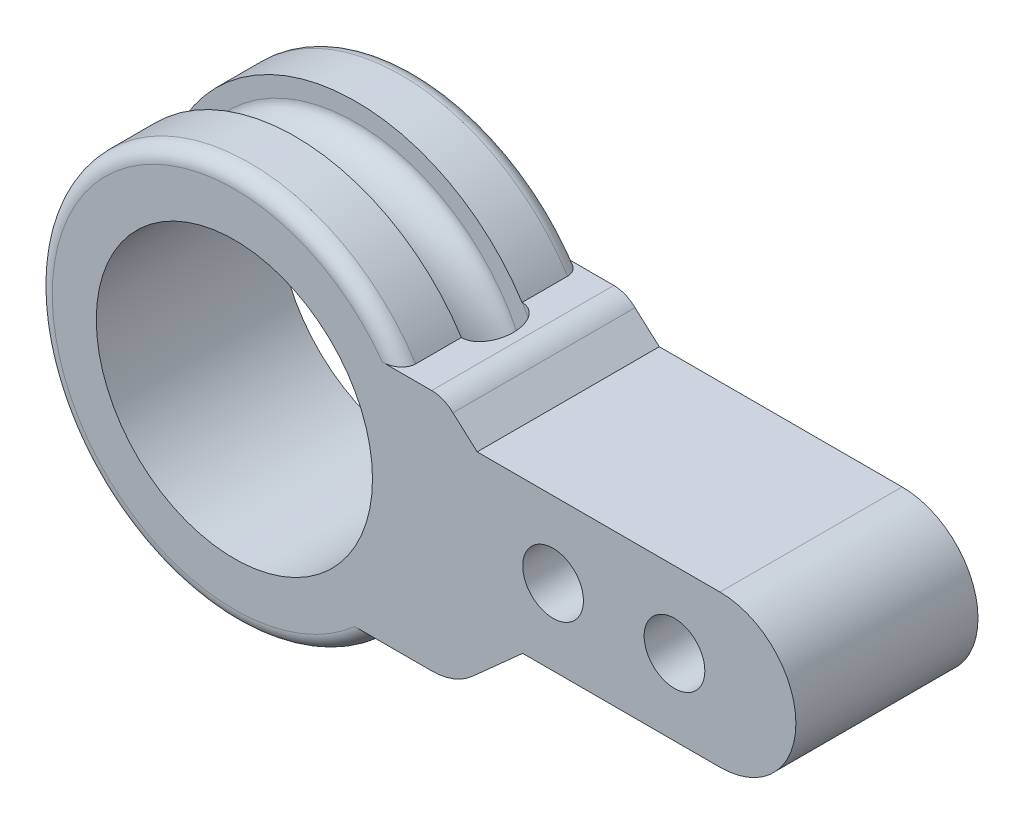
ISO-10303-21;
HEADER;
FILE_DESCRIPTION(('STEP AP214'),'2;1');
FILE_NAME('part.step','',(''),(''),'','','');
FILE_SCHEMA(('AUTOMOTIVE_DESIGN { 1 0 10303 214 1 1 1 1 }'));
ENDSEC;
DATA;
#1=APPLICATION_CONTEXT('core data for automotive mechanical design processes');
#2=APPLICATION_PROTOCOL_DEFINITION('international standard','automotive_design',2000,#1);
#3=PRODUCT_CONTEXT('',#1,'mechanical');
#4=PRODUCT('Part','Part','',(#3));
#5=PRODUCT_RELATED_PRODUCT_CATEGORY('part','',(#4));
#6=PRODUCT_DEFINITION_FORMATION('','',#4);
#7=PRODUCT_DEFINITION_CONTEXT('part definition',#1,'design');
#8=PRODUCT_DEFINITION('design','',#6,#7);
#9=PRODUCT_DEFINITION_SHAPE('','',#8);
#10=(LENGTH_UNIT() NAMED_UNIT(*) SI_UNIT(.MILLI.,.METRE.));
#11=(NAMED_UNIT(*) PLANE_ANGLE_UNIT() SI_UNIT($,.RADIAN.));
#12=(NAMED_UNIT(*) SI_UNIT($,.STERADIAN.) SOLID_ANGLE_UNIT());
#13=UNCERTAINTY_MEASURE_WITH_UNIT(LENGTH_MEASURE(1.E-05),#10,'distance_accuracy_value','');
#14=(GEOMETRIC_REPRESENTATION_CONTEXT(3) GLOBAL_UNCERTAINTY_ASSIGNED_CONTEXT((#13)) GLOBAL_UNIT_ASSIGNED_CONTEXT((#10,
#11,#12)) REPRESENTATION_CONTEXT('',''));
#15=CARTESIAN_POINT('',(0.,0.,0.));
#16=DIRECTION('',(0.,0.,1.));
#17=DIRECTION('',(1.,0.,0.));
#18=AXIS2_PLACEMENT_3D('',#15,#16,#17);
#19=CARTESIAN_POINT('',(4.69041575982343,-4.5,6.));
#20=DIRECTION('',(0.,1.,0.));
#21=DIRECTION('',(-1.,0.,0.));
#22=AXIS2_PLACEMENT_3D('',#19,#20,#21);
#23=PLANE('',#22);
#24=DIRECTION('',(1.,0.,0.));
#25=VECTOR('',#24,1.);
#26=CARTESIAN_POINT('',(4.69041575982343,-4.5,1.99843119348952));
#27=LINE('',#26,#25);
#28=CARTESIAN_POINT('',(4.69041575982343,-4.5,1.99843119348952));
#29=VERTEX_POINT('',#28);
#30=CARTESIAN_POINT('',(4.70292640209629,-4.5,1.99843119348952));
#31=VERTEX_POINT('',#30);
#32=EDGE_CURVE('E331',#29,#31,#27,.T.);
#33=ORIENTED_EDGE('',*,*,#32,.F.);
#34=DIRECTION('',(0.,0.,-1.));
#35=VECTOR('',#34,1.);
#36=CARTESIAN_POINT('',(4.69041575982343,-4.5,6.));
#37=LINE('',#36,#35);
#38=CARTESIAN_POINT('',(4.69041575982343,-4.5,0.5));
#39=VERTEX_POINT('',#38);
#40=EDGE_CURVE('E269',#29,#39,#37,.T.);
#41=ORIENTED_EDGE('',*,*,#40,.T.);
#42=CARTESIAN_POINT('',(4.69041575982343,-4.5,0.5));
#43=CARTESIAN_POINT('',(4.69046537652777,-4.5,0.477435894246101));
#44=CARTESIAN_POINT('',(4.68830269162119,-4.5,0.454921435409397));
#45=CARTESIAN_POINT('',(4.67997823823914,-4.5,0.410819562790677));
#46=CARTESIAN_POINT('',(4.67384799051555,-4.5,0.389226259859455));
#47=CARTESIAN_POINT('',(4.65802055845903,-4.5,0.347468311743127));
#48=CARTESIAN_POINT('',(4.6483316700506,-4.5,0.327300472864482));
#49=CARTESIAN_POINT('',(4.62595094998364,-4.5,0.288679046309985));
#50=CARTESIAN_POINT('',(4.61325306859329,-4.5,0.270229017845921));
#51=CARTESIAN_POINT('',(4.58024870667188,-4.5,0.228764020782996));
#52=CARTESIAN_POINT('',(4.55886895190151,-4.5,0.206603789262592));
#53=CARTESIAN_POINT('',(4.51283159759992,-4.5,0.16602778193332));
#54=CARTESIAN_POINT('',(4.48816905095371,-4.5,0.147617765728626));
#55=CARTESIAN_POINT('',(4.42647408970912,-4.5,0.107896339249215));
#56=CARTESIAN_POINT('',(4.38836978776521,-4.5,0.0882555301017659));
#57=CARTESIAN_POINT('',(4.30949239739979,-4.5,0.0552172655329858));
#58=CARTESIAN_POINT('',(4.2687111895483,-4.5,0.0418399098794695));
#59=CARTESIAN_POINT('',(4.18484325552582,-4.5,0.0205072380816803));
#60=CARTESIAN_POINT('',(4.14172564115187,-4.5,0.0126765797759273));
#61=CARTESIAN_POINT('',(4.05525141222487,-4.5,0.00246288384611344));
#62=CARTESIAN_POINT('',(4.01190090043998,-4.5,2.90971626731649E-05));
#63=CARTESIAN_POINT('',(3.96862696659689,-4.5,0.));
#64=B_SPLINE_CURVE_WITH_KNOTS('',3,(#42,#43,#44,#45,#46,#47,#48,#49,#50,#51,#52,#53,#54,#55,#56,
#57,#58,#59,#60,#61,#62,#63),.UNSPECIFIED.,.F.,.F.,(4,2,2,2,2,2,2,2,2,2,4),(0.,
0.0675101975108339,0.13449052909454,0.201315696643802,0.268276376866319,0.360144281768296,
0.452152231551562,0.580059187027035,0.70837383636552,0.839487880022016,0.969363679203713),.UNSPECIFIED.);
#65=CARTESIAN_POINT('',(3.96862696659689,-4.5,0.));
#66=VERTEX_POINT('',#65);
#67=EDGE_CURVE('E46',#39,#66,#64,.T.);
#68=ORIENTED_EDGE('',*,*,#67,.T.);
#69=DIRECTION('',(1.,0.,0.));
#70=VECTOR('',#69,1.);
#71=CARTESIAN_POINT('',(4.69041575982343,-4.5,0.));
#72=LINE('',#71,#70);
#73=CARTESIAN_POINT('',(6.5,-4.5,0.));
#74=VERTEX_POINT('',#73);
#75=EDGE_CURVE('E53',#66,#74,#72,.T.);
#76=ORIENTED_EDGE('',*,*,#75,.T.);
#77=DIRECTION('',(0.,0.,-1.));
#78=VECTOR('',#77,1.);
#79=CARTESIAN_POINT('',(6.5,-4.5,6.));
#80=LINE('',#79,#78);
#81=CARTESIAN_POINT('',(6.5,-4.5,6.));
#82=VERTEX_POINT('',#81);
#83=EDGE_CURVE('E307',#82,#74,#80,.T.);
#84=ORIENTED_EDGE('',*,*,#83,.F.);
#85=DIRECTION('',(1.,0.,0.));
#86=VECTOR('',#85,1.);
#87=CARTESIAN_POINT('',(4.69041575982343,-4.5,6.));
#88=LINE('',#87,#86);
#89=CARTESIAN_POINT('',(3.96862696659689,-4.5,6.));
#90=VERTEX_POINT('',#89);
#91=EDGE_CURVE('E277',#90,#82,#88,.T.);
#92=ORIENTED_EDGE('',*,*,#91,.F.);
#93=CARTESIAN_POINT('',(3.96862696659689,-4.5,6.));
#94=CARTESIAN_POINT('',(3.99802029687905,-4.5,5.99999348194439));
#95=CARTESIAN_POINT('',(4.02742542765712,-4.5,5.99886531954606));
#96=CARTESIAN_POINT('',(4.08612015880853,-4.5,5.99422798231408));
#97=CARTESIAN_POINT('',(4.11540927922784,-4.5,5.99071279574863));
#98=CARTESIAN_POINT('',(4.17392854781381,-4.5,5.98110548921874));
#99=CARTESIAN_POINT('',(4.20315383802389,-4.5,5.97498317333484));
#100=CARTESIAN_POINT('',(4.26085769006044,-4.5,5.95998349542072));
#101=CARTESIAN_POINT('',(4.28933708519732,-4.5,5.95110936372481));
#102=CARTESIAN_POINT('',(4.35097557260866,-4.5,5.9282519639138));
#103=CARTESIAN_POINT('',(4.38388982794724,-4.5,5.91359273397564));
#104=CARTESIAN_POINT('',(4.44710534987605,-4.5,5.87958983517621));
#105=CARTESIAN_POINT('',(4.47741603444311,-4.5,5.86026410561199));
#106=CARTESIAN_POINT('',(4.52803237251128,-4.5,5.82131304688694));
#107=CARTESIAN_POINT('',(4.54908254417555,-4.5,5.80266075374154));
#108=CARTESIAN_POINT('',(4.58794499868892,-4.5,5.7622073918141));
#109=CARTESIAN_POINT('',(4.60575978064991,-4.5,5.74040877690697));
#110=CARTESIAN_POINT('',(4.63401896132443,-4.5,5.69841834983111));
#111=CARTESIAN_POINT('',(4.64522300041559,-4.5,5.67873926453515));
#112=CARTESIAN_POINT('',(4.6642135136608,-4.5,5.63781164260914));
#113=CARTESIAN_POINT('',(4.67200687306826,-4.5,5.61656637001239));
#114=CARTESIAN_POINT('',(4.68197129086965,-4.5,5.57938022514238));
#115=CARTESIAN_POINT('',(4.68511879851945,-4.5,5.56369685782127));
#116=CARTESIAN_POINT('',(4.68934965800585,-4.5,5.53201442197269));
#117=CARTESIAN_POINT('',(4.6904276743418,-4.5,5.51601464456956));
#118=CARTESIAN_POINT('',(4.69041575982343,-4.5,5.5));
#119=B_SPLINE_CURVE_WITH_KNOTS('',3,(#93,#94,#95,#96,#97,#98,#99,#100,#101,#102,#103,#104,#105,
#106,#107,#108,#109,#110,#111,#112,#113,#114,#115,#116,#117,#118),.UNSPECIFIED.,.F.,.F.,(4,2,2,
2,2,2,2,2,2,2,2,2,4),(0.,0.0881763149763911,0.176575530107035,0.266027695661564,
0.355375249034633,0.463132234871527,0.570481390081753,0.654560585154361,0.73857455612226,
0.80624044126624,0.873769089731209,0.921627650169849,0.969609433276923),.UNSPECIFIED.);
#120=CARTESIAN_POINT('',(4.69041575982343,-4.5,5.5));
#121=VERTEX_POINT('',#120);
#122=EDGE_CURVE('E244',#90,#121,#119,.T.);
#123=ORIENTED_EDGE('',*,*,#122,.T.);
#124=CARTESIAN_POINT('',(4.69041575982343,-4.5,3.99843119348952));
#125=VERTEX_POINT('',#124);
#126=EDGE_CURVE('E286',#121,#125,#37,.T.);
#127=ORIENTED_EDGE('',*,*,#126,.T.);
#128=DIRECTION('',(-1.,0.,0.));
#129=VECTOR('',#128,1.);
#130=CARTESIAN_POINT('',(4.69041575982343,-4.5,3.99843119348952));
#131=LINE('',#130,#129);
#132=CARTESIAN_POINT('',(4.70292640209629,-4.5,3.99843119348952));
#133=VERTEX_POINT('',#132);
#134=EDGE_CURVE('E162',#133,#125,#131,.T.);
#135=ORIENTED_EDGE('',*,*,#134,.F.);
#136=CARTESIAN_POINT('',(4.70292640209629,-4.5,3.99843119348952));
#137=CARTESIAN_POINT('',(4.72207468590351,-4.5,3.99843271973142));
#138=CARTESIAN_POINT('',(4.74121543834601,-4.5,3.99763288816709));
#139=CARTESIAN_POINT('',(4.77935975373242,-4.5,3.99442474316628));
#140=CARTESIAN_POINT('',(4.79836332853766,-4.5,3.9920165705236));
#141=CARTESIAN_POINT('',(4.85481016934785,-4.5,3.98240134539255));
#142=CARTESIAN_POINT('',(4.89187442163675,-4.5,3.97280363814264));
#143=CARTESIAN_POINT('',(4.96389349180584,-4.5,3.9475660861733));
#144=CARTESIAN_POINT('',(4.9988462152444,-4.5,3.93192035256708));
#145=CARTESIAN_POINT('',(5.06582307625507,-4.5,3.89527247052552));
#146=CARTESIAN_POINT('',(5.09784573004788,-4.5,3.87426762842528));
#147=CARTESIAN_POINT('',(5.160105241582,-4.5,3.82646198950584));
#148=CARTESIAN_POINT('',(5.19014275559974,-4.5,3.79940318682905));
#149=CARTESIAN_POINT('',(5.24605900916883,-4.5,3.74128624906075));
#150=CARTESIAN_POINT('',(5.27193407593936,-4.5,3.71022462508352));
#151=CARTESIAN_POINT('',(5.32981505981013,-4.49999999999999,3.63078057260934));
#152=CARTESIAN_POINT('',(5.35957151279928,-4.5,3.58075320388895));
#153=CARTESIAN_POINT('',(5.4105568749744,-4.5,3.47650824115331));
#154=CARTESIAN_POINT('',(5.43176952929273,-4.5,3.42228289172068));
#155=CARTESIAN_POINT('',(5.46620618165703,-4.5,3.31058945504277));
#156=CARTESIAN_POINT('',(5.47932081755871,-4.5,3.25308796620198));
#157=CARTESIAN_POINT('',(5.49740336618089,-4.5,3.13684066750762));
#158=CARTESIAN_POINT('',(5.50236924315946,-4.5,3.07809455042982));
#159=CARTESIAN_POINT('',(5.50444749408797,-4.5,2.94918311772712));
#160=CARTESIAN_POINT('',(5.49988043192396,-4.5,2.87897788356932));
#161=CARTESIAN_POINT('',(5.48438422066897,-4.5,2.77505322904287));
#162=CARTESIAN_POINT('',(5.47777697614783,-4.5,2.74063942027466));
#163=CARTESIAN_POINT('',(5.46161164767258,-4.5,2.67245696694464));
#164=CARTESIAN_POINT('',(5.45204958425334,-4.5,2.63868925805532));
#165=CARTESIAN_POINT('',(5.42313927085772,-4.5,2.55181527365808));
#166=CARTESIAN_POINT('',(5.40138005963799,-4.5,2.49948404430528));
#167=CARTESIAN_POINT('',(5.34973106850188,-4.5,2.39905643090719));
#168=CARTESIAN_POINT('',(5.31985720578898,-4.5,2.35095199778716));
#169=CARTESIAN_POINT('',(5.25857196679343,-4.5,2.26992120421374));
#170=CARTESIAN_POINT('',(5.22864371462777,-4.5,2.23587766227944));
#171=CARTESIAN_POINT('',(5.16360038452457,-4.5,2.17312882273309));
#172=CARTESIAN_POINT('',(5.12848813479098,-4.5,2.14442063351282));
#173=CARTESIAN_POINT('',(5.0533176675696,-4.5,2.0935841153982));
#174=CARTESIAN_POINT('',(5.01322102475276,-4.5,2.07151204194681));
#175=CARTESIAN_POINT('',(4.92947886640111,-4.5,2.03566013697044));
#176=CARTESIAN_POINT('',(4.88583844254941,-4.5,2.02186863915999));
#177=CARTESIAN_POINT('',(4.81855408290306,-4.5,2.00787768386837));
#178=CARTESIAN_POINT('',(4.79556138993356,-4.49999999999999,2.00432958298985));
#179=CARTESIAN_POINT('',(4.74935851983353,-4.5,1.99960571947351));
#180=CARTESIAN_POINT('',(4.72614860689936,-4.50000000000002,1.99842737678428));
#181=CARTESIAN_POINT('',(4.70292640209645,-4.50000000000005,1.99843119348952));
#182=B_SPLINE_CURVE_WITH_KNOTS('',3,(#136,#137,#138,#139,#140,#141,#142,#143,#144,#145,#146,
#147,#148,#149,#150,#151,#152,#153,#154,#155,#156,#157,#158,#159,#160,#161,#162,#163,#164,#165,
#166,#167,#168,#169,#170,#171,#172,#173,#174,#175,#176,#177,#178,#179,#180,#181),.UNSPECIFIED.,
.F.,.F.,(4,2,2,2,2,2,2,2,2,2,2,2,2,2,2,2,2,2,2,2,2,2,4),(0.,0.0574123165189089,
0.114819607835953,0.229086746463998,0.34346542695295,0.457901711594274,0.57872331219648,
0.699650943138519,0.873330741760275,1.0473394287376,1.22364942249786,1.40000345572942,
1.61000957905854,1.71503002024462,1.82019252095396,1.98953592110764,2.15854951687747,
2.29400344121919,2.42938373795599,2.5658812607857,2.70218602181477,2.77187272151152,
2.84148350932177),.UNSPECIFIED.);
#183=EDGE_CURVE('E171',#133,#31,#182,.T.);
#184=ORIENTED_EDGE('',*,*,#183,.T.);
#185=EDGE_LOOP('',(#33,#41,#68,#76,#84,#92,#123,#127,#135,#184));
#186=FACE_BOUND('',#185,.T.);
#187=ADVANCED_FACE('F32',(#186),#23,.F.);
#188=CARTESIAN_POINT('',(6.5,3.5,6.));
#189=DIRECTION('',(0.,-1.,0.));
#190=DIRECTION('',(0.,0.,-1.));
#191=AXIS2_PLACEMENT_3D('',#188,#189,#190);
#192=PLANE('',#191);
#193=DIRECTION('',(-1.,0.,0.));
#194=VECTOR('',#193,1.);
#195=CARTESIAN_POINT('',(6.5,3.5,1.99843119348952));
#196=LINE('',#195,#194);
#197=CARTESIAN_POINT('',(5.48794285170084,3.5,1.99843119348952));
#198=VERTEX_POINT('',#197);
#199=CARTESIAN_POINT('',(5.47722557505166,3.5,1.99843119348952));
#200=VERTEX_POINT('',#199);
#201=EDGE_CURVE('E177',#198,#200,#196,.T.);
#202=ORIENTED_EDGE('',*,*,#201,.F.);
#203=CARTESIAN_POINT('',(5.48794285170084,3.5,1.99843119348952));
#204=CARTESIAN_POINT('',(5.50334077697644,3.4999999999999,1.9984286766703));
#205=CARTESIAN_POINT('',(5.51873038447994,3.49999999999995,1.99913415339519));
#206=CARTESIAN_POINT('',(5.54937369955001,3.50000000000005,2.00194097097522));
#207=CARTESIAN_POINT('',(5.56462747474249,3.5000000000001,2.00404157273644));
#208=CARTESIAN_POINT('',(5.6097774594412,3.4999999999998,2.01236035954246));
#209=CARTESIAN_POINT('',(5.6393236851537,3.49999999999903,2.02059633730872));
#210=CARTESIAN_POINT('',(5.69498668064814,3.49999999999904,2.04132870959261));
#211=CARTESIAN_POINT('',(5.72120270115804,3.49999999999974,2.05356563565131));
#212=CARTESIAN_POINT('',(5.77159901382026,3.50000000000026,2.08173744713488));
#213=CARTESIAN_POINT('',(5.79577582494572,3.50000000000008,2.09767848822722));
#214=CARTESIAN_POINT('',(5.85241785634997,3.49999999999988,2.14061564336957));
#215=CARTESIAN_POINT('',(5.8835852755012,3.49999999999997,2.16932534800375));
#216=CARTESIAN_POINT('',(5.94090551535545,3.50000000000003,2.2313753385966));
#217=CARTESIAN_POINT('',(5.96704720825796,3.50000000000001,2.26472562463979));
#218=CARTESIAN_POINT('',(6.02411747447867,3.49999999999998,2.34880985441148));
#219=CARTESIAN_POINT('',(6.05271289835628,3.49999999999999,2.4011233160703));
#220=CARTESIAN_POINT('',(6.10128344964254,3.5,2.50956187065349));
#221=CARTESIAN_POINT('',(6.12124610661421,3.5,2.5656923429724));
#222=CARTESIAN_POINT('',(6.15832025899222,3.5,2.69816835013827));
#223=CARTESIAN_POINT('',(6.17256010857777,3.5,2.77531920808124));
#224=CARTESIAN_POINT('',(6.18832586450009,3.5,2.93095971860675));
#225=CARTESIAN_POINT('',(6.18983212715318,3.5,3.00945125258897));
#226=CARTESIAN_POINT('',(6.18014917709243,3.5,3.16645897407841));
#227=CARTESIAN_POINT('',(6.16883160039567,3.5,3.24496740537847));
#228=CARTESIAN_POINT('',(6.13253704281409,3.5,3.39873058057227));
#229=CARTESIAN_POINT('',(6.10759624782825,3.49999999999999,3.47399337658704));
#230=CARTESIAN_POINT('',(6.05542227638354,3.5,3.58917721587477));
#231=CARTESIAN_POINT('',(6.0330064712661,3.5,3.63129286368753));
#232=CARTESIAN_POINT('',(5.98215475934092,3.5,3.71174513770186));
#233=CARTESIAN_POINT('',(5.95372752285852,3.5,3.75008709124759));
#234=CARTESIAN_POINT('',(5.89760733348578,3.5,3.81317205388966));
#235=CARTESIAN_POINT('',(5.87118047367267,3.5,3.83903612248418));
#236=CARTESIAN_POINT('',(5.81450546384123,3.5,3.88620516967662));
#237=CARTESIAN_POINT('',(5.78426195998072,3.5,3.90751560804633));
#238=CARTESIAN_POINT('',(5.72601965749903,3.5,3.94095882641076));
#239=CARTESIAN_POINT('',(5.69857196393368,3.5,3.95404859436561));
#240=CARTESIAN_POINT('',(5.64188554740443,3.5,3.97544930427055));
#241=CARTESIAN_POINT('',(5.61265019978921,3.5,3.98376896225516));
#242=CARTESIAN_POINT('',(5.56728751642629,3.5,3.99242267824039));
#243=CARTESIAN_POINT('',(5.55150642238929,3.5,3.99467261887462));
#244=CARTESIAN_POINT('',(5.51980071183317,3.5,3.9976785911847));
#245=CARTESIAN_POINT('',(5.50387607697789,3.5,3.99843442920462));
#246=CARTESIAN_POINT('',(5.48794285170084,3.5,3.99843119348952));
#247=B_SPLINE_CURVE_WITH_KNOTS('',3,(#203,#204,#205,#206,#207,#208,#209,#210,#211,#212,#213,
#214,#215,#216,#217,#218,#219,#220,#221,#222,#223,#224,#225,#226,#227,#228,#229,#230,#231,#232,
#233,#234,#235,#236,#237,#238,#239,#240,#241,#242,#243,#244,#245,#246),.UNSPECIFIED.,.F.,.F.,(4,
2,2,2,2,2,2,2,2,2,2,2,2,2,2,2,2,2,2,2,2,4),(0.,0.0461613460436265,0.0922982567252823,
0.183799597253196,0.270264260634804,0.356873655808186,0.483290182954039,0.609983472664503,
0.787863229072435,0.965999089704198,1.20016381297026,1.43468970862082,1.67158405832455,
1.90785220931492,2.05057454370532,2.19309241589198,2.30363635946471,2.41404700850557,
2.5049029836907,2.59559241168007,2.64335125622968,2.69111629056712),.UNSPECIFIED.);
#248=CARTESIAN_POINT('',(5.48794285170084,3.5,3.99843119348952));
#249=VERTEX_POINT('',#248);
#250=EDGE_CURVE('E168',#198,#249,#247,.T.);
#251=ORIENTED_EDGE('',*,*,#250,.T.);
#252=DIRECTION('',(1.,0.,0.));
#253=VECTOR('',#252,1.);
#254=CARTESIAN_POINT('',(6.5,3.5,3.99843119348952));
#255=LINE('',#254,#253);
#256=CARTESIAN_POINT('',(5.47722557505166,3.5,3.99843119348952));
#257=VERTEX_POINT('',#256);
#258=EDGE_CURVE('E152',#257,#249,#255,.T.);
#259=ORIENTED_EDGE('',*,*,#258,.F.);
#260=DIRECTION('',(0.,0.,-1.));
#261=VECTOR('',#260,1.);
#262=CARTESIAN_POINT('',(5.47722557505166,3.5,6.));
#263=LINE('',#262,#261);
#264=CARTESIAN_POINT('',(5.47722557505166,3.5,5.5));
#265=VERTEX_POINT('',#264);
#266=EDGE_CURVE('E289',#265,#257,#263,.T.);
#267=ORIENTED_EDGE('',*,*,#266,.F.);
#268=CARTESIAN_POINT('',(5.47722557505166,3.5,5.5));
#269=CARTESIAN_POINT('',(5.47726481582653,3.5,5.52491111665246));
#270=CARTESIAN_POINT('',(5.47501914217816,3.5,5.54979177252489));
#271=CARTESIAN_POINT('',(5.4662769371196,3.5,5.59867925530071));
#272=CARTESIAN_POINT('',(5.45980036942027,3.5,5.62268962985444));
#273=CARTESIAN_POINT('',(5.44291831650103,3.5,5.66924726729247));
#274=CARTESIAN_POINT('',(5.43251668409802,3.5,5.69179593962215));
#275=CARTESIAN_POINT('',(5.40826723055494,3.5,5.73496718310933));
#276=CARTESIAN_POINT('',(5.39441628379915,3.5,5.75558798387674));
#277=CARTESIAN_POINT('',(5.36296500759481,3.5,5.79560659257241));
#278=CARTESIAN_POINT('',(5.3452002022522,3.5,5.81487450841689));
#279=CARTESIAN_POINT('',(5.30706839958671,3.5,5.85061809076725));
#280=CARTESIAN_POINT('',(5.28670068542917,3.5,5.86709298516301));
#281=CARTESIAN_POINT('',(5.24076606261637,3.5,5.89937459646024));
#282=CARTESIAN_POINT('',(5.2148759496292,3.5,5.91472061117677));
#283=CARTESIAN_POINT('',(5.16116943477937,3.5,5.94157752845654));
#284=CARTESIAN_POINT('',(5.13335114027928,3.5,5.95308459656663));
#285=CARTESIAN_POINT('',(5.07158135135597,3.5,5.97395008830876));
#286=CARTESIAN_POINT('',(5.03739335116492,3.5,5.98260671375737));
#287=CARTESIAN_POINT('',(4.96817072869764,3.5,5.99485466768476));
#288=CARTESIAN_POINT('',(4.93313727069004,3.5,5.99845259811985));
#289=CARTESIAN_POINT('',(4.8898382278915,3.5,5.99986631048816));
#290=CARTESIAN_POINT('',(4.88161640861235,3.5,6.00000002886093));
#291=CARTESIAN_POINT('',(4.87339717240448,3.5,6.));
#292=B_SPLINE_CURVE_WITH_KNOTS('',3,(#268,#269,#270,#271,#272,#273,#274,#275,#276,#277,#278,
#279,#280,#281,#282,#283,#284,#285,#286,#287,#288,#289,#290,#291),.UNSPECIFIED.,.F.,.F.,(4,2,2,
2,2,2,2,2,2,2,2,4),(0.,0.074584414437066,0.148819415707616,0.222981737159396,0.297211507321159,
0.375529218516475,0.453868544884369,0.543815447997553,0.633851925614056,0.739253569883144,
0.844517529432218,0.869181139187433),.UNSPECIFIED.);
#293=CARTESIAN_POINT('',(4.87339717240448,3.5,6.));
#294=VERTEX_POINT('',#293);
#295=EDGE_CURVE('E250',#265,#294,#292,.T.);
#296=ORIENTED_EDGE('',*,*,#295,.T.);
#297=DIRECTION('',(-1.,0.,0.));
#298=VECTOR('',#297,1.);
#299=CARTESIAN_POINT('',(6.5,3.5,6.));
#300=LINE('',#299,#298);
#301=CARTESIAN_POINT('',(6.5,3.5,6.));
#302=VERTEX_POINT('',#301);
#303=EDGE_CURVE('E323',#302,#294,#300,.T.);
#304=ORIENTED_EDGE('',*,*,#303,.F.);
#305=DIRECTION('',(0.,0.,-1.));
#306=VECTOR('',#305,1.);
#307=CARTESIAN_POINT('',(6.5,3.5,6.));
#308=LINE('',#307,#306);
#309=CARTESIAN_POINT('',(6.5,3.5,0.));
#310=VERTEX_POINT('',#309);
#311=EDGE_CURVE('E291',#302,#310,#308,.T.);
#312=ORIENTED_EDGE('',*,*,#311,.T.);
#313=DIRECTION('',(-1.,0.,0.));
#314=VECTOR('',#313,1.);
#315=CARTESIAN_POINT('',(6.5,3.5,0.));
#316=LINE('',#315,#314);
#317=CARTESIAN_POINT('',(4.87339717240448,3.5,0.));
#318=VERTEX_POINT('',#317);
#319=EDGE_CURVE('E60',#310,#318,#316,.T.);
#320=ORIENTED_EDGE('',*,*,#319,.T.);
#321=CARTESIAN_POINT('',(4.87339717240448,3.5,0.));
#322=CARTESIAN_POINT('',(4.91573251870398,3.5,-4.19378829391358E-06));
#323=CARTESIAN_POINT('',(4.95818006076902,3.5,0.00355088860123815));
#324=CARTESIAN_POINT('',(5.04202791099987,3.5,0.0180502130823545));
#325=CARTESIAN_POINT('',(5.08342091429619,3.5,0.0290362490104769));
#326=CARTESIAN_POINT('',(5.15499445283778,3.5,0.0555676253429574));
#327=CARTESIAN_POINT('',(5.18570664441115,3.5,0.0696747057921464));
#328=CARTESIAN_POINT('',(5.24435162916914,3.5,0.102709034014531));
#329=CARTESIAN_POINT('',(5.27229202499037,3.5,0.121622559868166));
#330=CARTESIAN_POINT('',(5.32026142626364,3.5,0.160846016186344));
#331=CARTESIAN_POINT('',(5.34084456609499,3.5,0.18047706057367));
#332=CARTESIAN_POINT('',(5.37850698620071,3.5,0.222896638115703));
#333=CARTESIAN_POINT('',(5.39558526265124,3.5,0.24568607273901));
#334=CARTESIAN_POINT('',(5.42550649224816,3.5,0.294132166091373));
#335=CARTESIAN_POINT('',(5.4383192527768,3.5,0.319807612571062));
#336=CARTESIAN_POINT('',(5.45875611391835,3.5,0.373129200323207));
#337=CARTESIAN_POINT('',(5.46639118737551,3.5,0.400771035984262));
#338=CARTESIAN_POINT('',(5.47319479080964,3.5,0.440611522808893));
#339=CARTESIAN_POINT('',(5.47470490860406,3.5,0.452444878070043));
#340=CARTESIAN_POINT('',(5.4767196684823,3.5,0.476183017736188));
#341=CARTESIAN_POINT('',(5.47722547342537,3.5,0.488087703504528));
#342=CARTESIAN_POINT('',(5.47722557505194,3.5,0.499999999999954));
#343=B_SPLINE_CURVE_WITH_KNOTS('',3,(#321,#322,#323,#324,#325,#326,#327,#328,#329,#330,#331,
#332,#333,#334,#335,#336,#337,#338,#339,#340,#341,#342),.UNSPECIFIED.,.F.,.F.,(4,2,2,2,2,2,2,2,
2,2,4),(0.,0.127046438882263,0.254813431492576,0.355800609549377,0.456502656217368,
0.541484596723881,0.626490842944694,0.712086593876648,0.797500373821083,0.833253020376076,
0.868964245977096),.UNSPECIFIED.);
#344=CARTESIAN_POINT('',(5.47722557505166,3.5,0.5));
#345=VERTEX_POINT('',#344);
#346=EDGE_CURVE('E11',#318,#345,#343,.T.);
#347=ORIENTED_EDGE('',*,*,#346,.T.);
#348=EDGE_CURVE('E288',#200,#345,#263,.T.);
#349=ORIENTED_EDGE('',*,*,#348,.F.);
#350=EDGE_LOOP('',(#202,#251,#259,#267,#296,#304,#312,#320,#347,#349));
#351=FACE_BOUND('',#350,.T.);
#352=ADVANCED_FACE('F175',(#351),#192,.F.);
#353=CARTESIAN_POINT('',(0.,0.,6.));
#354=DIRECTION('',(0.,0.,-1.));
#355=DIRECTION('',(-1.,0.,0.));
#356=AXIS2_PLACEMENT_3D('',#353,#354,#355);
#357=CYLINDRICAL_SURFACE('',#356,6.5);
#358=ORIENTED_EDGE('',*,*,#348,.T.);
#359=CARTESIAN_POINT('',(0.,0.,0.5));
#360=DIRECTION('',(0.,0.,1.));
#361=DIRECTION('',(1.,0.,0.));
#362=AXIS2_PLACEMENT_3D('',#359,#360,#361);
#363=CIRCLE('',#362,6.5);
#364=EDGE_CURVE('E257',#345,#39,#363,.T.);
#365=ORIENTED_EDGE('',*,*,#364,.T.);
#366=ORIENTED_EDGE('',*,*,#40,.F.);
#367=CARTESIAN_POINT('',(0.,0.,1.99843119348952));
#368=DIRECTION('',(0.,0.,1.));
#369=DIRECTION('',(1.,0.,0.));
#370=AXIS2_PLACEMENT_3D('',#367,#368,#369);
#371=CIRCLE('',#370,6.5);
#372=EDGE_CURVE('E179',#200,#29,#371,.T.);
#373=ORIENTED_EDGE('',*,*,#372,.F.);
#374=EDGE_LOOP('',(#358,#365,#366,#373));
#375=FACE_BOUND('',#374,.T.);
#376=ADVANCED_FACE('F227',(#375),#357,.T.);
#377=ORIENTED_EDGE('',*,*,#126,.F.);
#378=CARTESIAN_POINT('',(0.,0.,5.5));
#379=DIRECTION('',(0.,0.,1.));
#380=DIRECTION('',(1.,0.,0.));
#381=AXIS2_PLACEMENT_3D('',#378,#379,#380);
#382=CIRCLE('',#381,6.5);
#383=EDGE_CURVE('E182',#121,#265,#382,.F.);
#384=ORIENTED_EDGE('',*,*,#383,.T.);
#385=ORIENTED_EDGE('',*,*,#266,.T.);
#386=CARTESIAN_POINT('',(0.,0.,3.99843119348952));
#387=DIRECTION('',(0.,0.,-1.));
#388=DIRECTION('',(-1.,0.,0.));
#389=AXIS2_PLACEMENT_3D('',#386,#387,#388);
#390=CIRCLE('',#389,6.5);
#391=EDGE_CURVE('E159',#125,#257,#390,.T.);
#392=ORIENTED_EDGE('',*,*,#391,.F.);
#393=EDGE_LOOP('',(#377,#384,#385,#392));
#394=FACE_BOUND('',#393,.T.);
#395=ADVANCED_FACE('F329',(#394),#357,.T.);
#396=CARTESIAN_POINT('',(6.5,-2.5,6.));
#397=DIRECTION('',(0.,0.,-1.));
#398=DIRECTION('',(-1.,0.,0.));
#399=AXIS2_PLACEMENT_3D('',#396,#397,#398);
#400=CYLINDRICAL_SURFACE('',#399,2.);
#401=CARTESIAN_POINT('',(6.5,-2.5,0.));
#402=DIRECTION('',(0.,0.,1.));
#403=DIRECTION('',(1.,0.,0.));
#404=AXIS2_PLACEMENT_3D('',#401,#402,#403);
#405=CIRCLE('',#404,2.);
#406=CARTESIAN_POINT('',(7.83333333333333,-3.99071198499986,0.));
#407=VERTEX_POINT('',#406);
#408=EDGE_CURVE('E312',#74,#407,#405,.T.);
#409=ORIENTED_EDGE('',*,*,#408,.T.);
#410=DIRECTION('',(0.,0.,-1.));
#411=VECTOR('',#410,1.);
#412=CARTESIAN_POINT('',(7.83333333333333,-3.99071198499986,6.));
#413=LINE('',#412,#411);
#414=CARTESIAN_POINT('',(7.83333333333333,-3.99071198499986,6.));
#415=VERTEX_POINT('',#414);
#416=EDGE_CURVE('E305',#415,#407,#413,.T.);
#417=ORIENTED_EDGE('',*,*,#416,.F.);
#418=CARTESIAN_POINT('',(6.5,-2.5,6.));
#419=DIRECTION('',(0.,0.,1.));
#420=DIRECTION('',(1.,0.,0.));
#421=AXIS2_PLACEMENT_3D('',#418,#419,#420);
#422=CIRCLE('',#421,2.);
#423=EDGE_CURVE('E280',#82,#415,#422,.T.);
#424=ORIENTED_EDGE('',*,*,#423,.F.);
#425=ORIENTED_EDGE('',*,*,#83,.T.);
#426=EDGE_LOOP('',(#409,#417,#424,#425));
#427=FACE_BOUND('',#426,.T.);
#428=ADVANCED_FACE('F231',(#427),#400,.T.);
#429=CARTESIAN_POINT('',(9.5,-2.5,6.));
#430=DIRECTION('',(0.666666666666667,-0.74535599249993,0.));
#431=DIRECTION('',(0.74535599249993,0.666666666666667,0.));
#432=AXIS2_PLACEMENT_3D('',#429,#430,#431);
#433=PLANE('',#432);
#434=DIRECTION('',(-0.74535599249993,-0.666666666666667,0.));
#435=VECTOR('',#434,1.);
#436=CARTESIAN_POINT('',(9.5,-2.5,0.));
#437=LINE('',#436,#435);
#438=CARTESIAN_POINT('',(9.5,-2.5,0.));
#439=VERTEX_POINT('',#438);
#440=EDGE_CURVE('E369',#439,#407,#437,.T.);
#441=ORIENTED_EDGE('',*,*,#440,.F.);
#442=DIRECTION('',(0.,0.,-1.));
#443=VECTOR('',#442,1.);
#444=CARTESIAN_POINT('',(9.5,-2.5,6.));
#445=LINE('',#444,#443);
#446=CARTESIAN_POINT('',(9.5,-2.5,6.));
#447=VERTEX_POINT('',#446);
#448=EDGE_CURVE('E303',#447,#439,#445,.T.);
#449=ORIENTED_EDGE('',*,*,#448,.F.);
#450=DIRECTION('',(-0.74535599249993,-0.666666666666667,0.));
#451=VECTOR('',#450,1.);
#452=CARTESIAN_POINT('',(9.5,-2.5,6.));
#453=LINE('',#452,#451);
#454=EDGE_CURVE('E354',#447,#415,#453,.T.);
#455=ORIENTED_EDGE('',*,*,#454,.T.);
#456=ORIENTED_EDGE('',*,*,#416,.T.);
#457=EDGE_LOOP('',(#441,#449,#455,#456));
#458=FACE_BOUND('',#457,.T.);
#459=ADVANCED_FACE('F404',(#458),#433,.T.);
#460=CARTESIAN_POINT('',(9.5,-2.5,6.));
#461=DIRECTION('',(0.,1.,0.));
#462=DIRECTION('',(0.,0.,1.));
#463=AXIS2_PLACEMENT_3D('',#460,#461,#462);
#464=PLANE('',#463);
#465=DIRECTION('',(1.,0.,0.));
#466=VECTOR('',#465,1.);
#467=CARTESIAN_POINT('',(9.5,-2.5,0.));
#468=LINE('',#467,#466);
#469=CARTESIAN_POINT('',(16.,-2.5,0.));
#470=VERTEX_POINT('',#469);
#471=EDGE_CURVE('E371',#439,#470,#468,.T.);
#472=ORIENTED_EDGE('',*,*,#471,.T.);
#473=DIRECTION('',(0.,0.,-1.));
#474=VECTOR('',#473,1.);
#475=CARTESIAN_POINT('',(16.,-2.5,6.));
#476=LINE('',#475,#474);
#477=CARTESIAN_POINT('',(16.,-2.5,6.));
#478=VERTEX_POINT('',#477);
#479=EDGE_CURVE('E300',#478,#470,#476,.T.);
#480=ORIENTED_EDGE('',*,*,#479,.F.);
#481=DIRECTION('',(1.,0.,0.));
#482=VECTOR('',#481,1.);
#483=CARTESIAN_POINT('',(9.5,-2.5,6.));
#484=LINE('',#483,#482);
#485=EDGE_CURVE('E357',#447,#478,#484,.T.);
#486=ORIENTED_EDGE('',*,*,#485,.F.);
#487=ORIENTED_EDGE('',*,*,#448,.T.);
#488=EDGE_LOOP('',(#472,#480,#486,#487));
#489=FACE_BOUND('',#488,.T.);
#490=ADVANCED_FACE('F401',(#489),#464,.F.);
#491=CARTESIAN_POINT('',(16.,0.,6.));
#492=DIRECTION('',(0.,0.,-1.));
#493=DIRECTION('',(-1.,0.,0.));
#494=AXIS2_PLACEMENT_3D('',#491,#492,#493);
#495=CYLINDRICAL_SURFACE('',#494,2.5);
#496=CARTESIAN_POINT('',(16.,0.,0.));
#497=DIRECTION('',(0.,0.,1.));
#498=DIRECTION('',(1.,0.,0.));
#499=AXIS2_PLACEMENT_3D('',#496,#497,#498);
#500=CIRCLE('',#499,2.5);
#501=CARTESIAN_POINT('',(16.,2.5,0.));
#502=VERTEX_POINT('',#501);
#503=EDGE_CURVE('E373',#470,#502,#500,.T.);
#504=ORIENTED_EDGE('',*,*,#503,.T.);
#505=DIRECTION('',(0.,0.,-1.));
#506=VECTOR('',#505,1.);
#507=CARTESIAN_POINT('',(16.,2.5,6.));
#508=LINE('',#507,#506);
#509=CARTESIAN_POINT('',(16.,2.5,6.));
#510=VERTEX_POINT('',#509);
#511=EDGE_CURVE('E298',#510,#502,#508,.T.);
#512=ORIENTED_EDGE('',*,*,#511,.F.);
#513=CARTESIAN_POINT('',(16.,0.,6.));
#514=DIRECTION('',(0.,0.,1.));
#515=DIRECTION('',(1.,0.,0.));
#516=AXIS2_PLACEMENT_3D('',#513,#514,#515);
#517=CIRCLE('',#516,2.5);
#518=EDGE_CURVE('E359',#478,#510,#517,.T.);
#519=ORIENTED_EDGE('',*,*,#518,.F.);
#520=ORIENTED_EDGE('',*,*,#479,.T.);
#521=EDGE_LOOP('',(#504,#512,#519,#520));
#522=FACE_BOUND('',#521,.T.);
#523=ADVANCED_FACE('F397',(#522),#495,.T.);
#524=CARTESIAN_POINT('',(8.,2.5,6.));
#525=DIRECTION('',(0.,1.,0.));
#526=DIRECTION('',(0.,0.,1.));
#527=AXIS2_PLACEMENT_3D('',#524,#525,#526);
#528=PLANE('',#527);
#529=DIRECTION('',(1.,0.,0.));
#530=VECTOR('',#529,1.);
#531=CARTESIAN_POINT('',(8.,2.5,0.));
#532=LINE('',#531,#530);
#533=CARTESIAN_POINT('',(8.,2.5,0.));
#534=VERTEX_POINT('',#533);
#535=EDGE_CURVE('E376',#534,#502,#532,.T.);
#536=ORIENTED_EDGE('',*,*,#535,.F.);
#537=DIRECTION('',(0.,0.,-1.));
#538=VECTOR('',#537,1.);
#539=CARTESIAN_POINT('',(8.,2.5,6.));
#540=LINE('',#539,#538);
#541=CARTESIAN_POINT('',(8.,2.5,6.));
#542=VERTEX_POINT('',#541);
#543=EDGE_CURVE('E296',#542,#534,#540,.T.);
#544=ORIENTED_EDGE('',*,*,#543,.F.);
#545=DIRECTION('',(1.,0.,0.));
#546=VECTOR('',#545,1.);
#547=CARTESIAN_POINT('',(8.,2.5,6.));
#548=LINE('',#547,#546);
#549=EDGE_CURVE('E361',#542,#510,#548,.T.);
#550=ORIENTED_EDGE('',*,*,#549,.T.);
#551=ORIENTED_EDGE('',*,*,#511,.T.);
#552=EDGE_LOOP('',(#536,#544,#550,#551));
#553=FACE_BOUND('',#552,.T.);
#554=ADVANCED_FACE('F392',(#553),#528,.T.);
#555=CARTESIAN_POINT('',(8.,2.5,6.));
#556=DIRECTION('',(-0.665889023142786,-0.746050808496275,0.));
#557=DIRECTION('',(0.746050808496275,-0.665889023142786,0.));
#558=AXIS2_PLACEMENT_3D('',#555,#556,#557);
#559=PLANE('',#558);
#560=DIRECTION('',(-0.746050808496275,0.665889023142786,0.));
#561=VECTOR('',#560,1.);
#562=CARTESIAN_POINT('',(8.,2.5,0.));
#563=LINE('',#562,#561);
#564=CARTESIAN_POINT('',(7.20113634430002,3.21302722718112,0.));
#565=VERTEX_POINT('',#564);
#566=EDGE_CURVE('E282',#534,#565,#563,.T.);
#567=ORIENTED_EDGE('',*,*,#566,.T.);
#568=DIRECTION('',(0.,0.,-1.));
#569=VECTOR('',#568,1.);
#570=CARTESIAN_POINT('',(7.20113634430002,3.21302722718112,6.));
#571=LINE('',#570,#569);
#572=CARTESIAN_POINT('',(7.20113634430002,3.21302722718112,6.));
#573=VERTEX_POINT('',#572);
#574=EDGE_CURVE('E293',#573,#565,#571,.T.);
#575=ORIENTED_EDGE('',*,*,#574,.F.);
#576=DIRECTION('',(-0.746050808496275,0.665889023142786,0.));
#577=VECTOR('',#576,1.);
#578=CARTESIAN_POINT('',(8.,2.5,6.));
#579=LINE('',#578,#577);
#580=EDGE_CURVE('E364',#542,#573,#579,.T.);
#581=ORIENTED_EDGE('',*,*,#580,.F.);
#582=ORIENTED_EDGE('',*,*,#543,.T.);
#583=EDGE_LOOP('',(#567,#575,#581,#582));
#584=FACE_BOUND('',#583,.T.);
#585=ADVANCED_FACE('F380',(#584),#559,.F.);
#586=CARTESIAN_POINT('',(6.5,2.5,6.));
#587=DIRECTION('',(0.,0.,-1.));
#588=DIRECTION('',(-1.,0.,0.));
#589=AXIS2_PLACEMENT_3D('',#586,#587,#588);
#590=CYLINDRICAL_SURFACE('',#589,1.);
#591=CARTESIAN_POINT('',(6.5,2.5,0.));
#592=DIRECTION('',(0.,0.,1.));
#593=DIRECTION('',(1.,0.,0.));
#594=AXIS2_PLACEMENT_3D('',#591,#592,#593);
#595=CIRCLE('',#594,1.);
#596=EDGE_CURVE('E276',#565,#310,#595,.T.);
#597=ORIENTED_EDGE('',*,*,#596,.T.);
#598=ORIENTED_EDGE('',*,*,#311,.F.);
#599=CARTESIAN_POINT('',(6.5,2.5,6.));
#600=DIRECTION('',(0.,0.,1.));
#601=DIRECTION('',(1.,0.,0.));
#602=AXIS2_PLACEMENT_3D('',#599,#600,#601);
#603=CIRCLE('',#602,1.);
#604=EDGE_CURVE('E325',#573,#302,#603,.T.);
#605=ORIENTED_EDGE('',*,*,#604,.F.);
#606=ORIENTED_EDGE('',*,*,#574,.T.);
#607=EDGE_LOOP('',(#597,#598,#605,#606));
#608=FACE_BOUND('',#607,.T.);
#609=ADVANCED_FACE('F384',(#608),#590,.T.);
#610=CARTESIAN_POINT('',(6.5,-2.5,6.));
#611=DIRECTION('',(0.,0.,1.));
#612=DIRECTION('',(1.,0.,0.));
#613=AXIS2_PLACEMENT_3D('',#610,#611,#612);
#614=PLANE('',#613);
#615=CARTESIAN_POINT('',(14.5,0.,6.));
#616=DIRECTION('',(0.,0.,1.));
#617=DIRECTION('',(1.,0.,0.));
#618=AXIS2_PLACEMENT_3D('',#615,#616,#617);
#619=CIRCLE('',#618,1.);
#620=CARTESIAN_POINT('',(15.5,0.,6.));
#621=VERTEX_POINT('',#620);
#622=EDGE_CURVE('E351',#621,#621,#619,.T.);
#623=ORIENTED_EDGE('',*,*,#622,.F.);
#624=EDGE_LOOP('',(#623));
#625=FACE_BOUND('',#624,.T.);
#626=CARTESIAN_POINT('',(10.5,0.,6.));
#627=DIRECTION('',(0.,0.,1.));
#628=DIRECTION('',(1.,0.,0.));
#629=AXIS2_PLACEMENT_3D('',#626,#627,#628);
#630=CIRCLE('',#629,1.);
#631=CARTESIAN_POINT('',(11.5,0.,6.));
#632=VERTEX_POINT('',#631);
#633=EDGE_CURVE('E335',#632,#632,#630,.T.);
#634=ORIENTED_EDGE('',*,*,#633,.F.);
#635=EDGE_LOOP('',(#634));
#636=FACE_BOUND('',#635,.T.);
#637=CARTESIAN_POINT('',(0.,0.,6.));
#638=DIRECTION('',(0.,0.,1.));
#639=DIRECTION('',(1.,0.,0.));
#640=AXIS2_PLACEMENT_3D('',#637,#638,#639);
#641=CIRCLE('',#640,4.55);
#642=CARTESIAN_POINT('',(4.55,0.,6.));
#643=VERTEX_POINT('',#642);
#644=EDGE_CURVE('E346',#643,#643,#641,.T.);
#645=ORIENTED_EDGE('',*,*,#644,.F.);
#646=EDGE_LOOP('',(#645));
#647=FACE_BOUND('',#646,.T.);
#648=CARTESIAN_POINT('',(0.,0.,6.));
#649=DIRECTION('',(0.,0.,1.));
#650=DIRECTION('',(1.,0.,0.));
#651=AXIS2_PLACEMENT_3D('',#648,#649,#650);
#652=CIRCLE('',#651,6.);
#653=EDGE_CURVE('E178',#294,#90,#652,.T.);
#654=ORIENTED_EDGE('',*,*,#653,.T.);
#655=ORIENTED_EDGE('',*,*,#91,.T.);
#656=ORIENTED_EDGE('',*,*,#423,.T.);
#657=ORIENTED_EDGE('',*,*,#454,.F.);
#658=ORIENTED_EDGE('',*,*,#485,.T.);
#659=ORIENTED_EDGE('',*,*,#518,.T.);
#660=ORIENTED_EDGE('',*,*,#549,.F.);
#661=ORIENTED_EDGE('',*,*,#580,.T.);
#662=ORIENTED_EDGE('',*,*,#604,.T.);
#663=ORIENTED_EDGE('',*,*,#303,.T.);
#664=EDGE_LOOP('',(#654,#655,#656,#657,#658,#659,#660,#661,#662,#663));
#665=FACE_BOUND('',#664,.T.);
#666=ADVANCED_FACE('F321',(#625,#636,#647,#665),#614,.T.);
#667=CARTESIAN_POINT('',(6.5,-2.5,0.));
#668=DIRECTION('',(0.,0.,1.));
#669=DIRECTION('',(1.,0.,0.));
#670=AXIS2_PLACEMENT_3D('',#667,#668,#669);
#671=PLANE('',#670);
#672=CARTESIAN_POINT('',(14.5,0.,0.));
#673=DIRECTION('',(0.,0.,1.));
#674=DIRECTION('',(1.,0.,0.));
#675=AXIS2_PLACEMENT_3D('',#672,#673,#674);
#676=CIRCLE('',#675,1.);
#677=CARTESIAN_POINT('',(15.5,0.,0.));
#678=VERTEX_POINT('',#677);
#679=EDGE_CURVE('E342',#678,#678,#676,.T.);
#680=ORIENTED_EDGE('',*,*,#679,.T.);
#681=EDGE_LOOP('',(#680));
#682=FACE_BOUND('',#681,.T.);
#683=CARTESIAN_POINT('',(10.5,0.,0.));
#684=DIRECTION('',(0.,0.,1.));
#685=DIRECTION('',(1.,0.,0.));
#686=AXIS2_PLACEMENT_3D('',#683,#684,#685);
#687=CIRCLE('',#686,1.);
#688=CARTESIAN_POINT('',(11.5,0.,0.));
#689=VERTEX_POINT('',#688);
#690=EDGE_CURVE('E337',#689,#689,#687,.T.);
#691=ORIENTED_EDGE('',*,*,#690,.T.);
#692=EDGE_LOOP('',(#691));
#693=FACE_BOUND('',#692,.T.);
#694=CARTESIAN_POINT('',(0.,0.,0.));
#695=DIRECTION('',(0.,0.,1.));
#696=DIRECTION('',(1.,0.,0.));
#697=AXIS2_PLACEMENT_3D('',#694,#695,#696);
#698=CIRCLE('',#697,4.55);
#699=CARTESIAN_POINT('',(4.55,0.,0.));
#700=VERTEX_POINT('',#699);
#701=EDGE_CURVE('E349',#700,#700,#698,.T.);
#702=ORIENTED_EDGE('',*,*,#701,.T.);
#703=EDGE_LOOP('',(#702));
#704=FACE_BOUND('',#703,.T.);
#705=ORIENTED_EDGE('',*,*,#75,.F.);
#706=CARTESIAN_POINT('',(0.,0.,0.));
#707=DIRECTION('',(0.,0.,1.));
#708=DIRECTION('',(1.,0.,0.));
#709=AXIS2_PLACEMENT_3D('',#706,#707,#708);
#710=CIRCLE('',#709,6.);
#711=EDGE_CURVE('E260',#66,#318,#710,.F.);
#712=ORIENTED_EDGE('',*,*,#711,.T.);
#713=ORIENTED_EDGE('',*,*,#319,.F.);
#714=ORIENTED_EDGE('',*,*,#596,.F.);
#715=ORIENTED_EDGE('',*,*,#566,.F.);
#716=ORIENTED_EDGE('',*,*,#535,.T.);
#717=ORIENTED_EDGE('',*,*,#503,.F.);
#718=ORIENTED_EDGE('',*,*,#471,.F.);
#719=ORIENTED_EDGE('',*,*,#440,.T.);
#720=ORIENTED_EDGE('',*,*,#408,.F.);
#721=EDGE_LOOP('',(#705,#712,#713,#714,#715,#716,#717,#718,#719,#720));
#722=FACE_BOUND('',#721,.T.);
#723=ADVANCED_FACE('F273',(#682,#693,#704,#722),#671,.F.);
#724=CARTESIAN_POINT('',(0.,0.,6.));
#725=DIRECTION('',(0.,0.,-1.));
#726=DIRECTION('',(-1.,0.,0.));
#727=AXIS2_PLACEMENT_3D('',#724,#725,#726);
#728=CYLINDRICAL_SURFACE('',#727,4.55);
#729=ORIENTED_EDGE('',*,*,#644,.T.);
#730=EDGE_LOOP('',(#729));
#731=FACE_BOUND('',#730,.T.);
#732=ORIENTED_EDGE('',*,*,#701,.F.);
#733=EDGE_LOOP('',(#732));
#734=FACE_BOUND('',#733,.T.);
#735=ADVANCED_FACE('F429',(#731,#734),#728,.F.);
#736=CARTESIAN_POINT('',(10.5,0.,6.));
#737=DIRECTION('',(0.,0.,-1.));
#738=DIRECTION('',(-1.,0.,0.));
#739=AXIS2_PLACEMENT_3D('',#736,#737,#738);
#740=CYLINDRICAL_SURFACE('',#739,1.);
#741=ORIENTED_EDGE('',*,*,#633,.T.);
#742=EDGE_LOOP('',(#741));
#743=FACE_BOUND('',#742,.T.);
#744=ORIENTED_EDGE('',*,*,#690,.F.);
#745=EDGE_LOOP('',(#744));
#746=FACE_BOUND('',#745,.T.);
#747=ADVANCED_FACE('F433',(#743,#746),#740,.F.);
#748=CARTESIAN_POINT('',(14.5,0.,6.));
#749=DIRECTION('',(0.,0.,-1.));
#750=DIRECTION('',(-1.,0.,0.));
#751=AXIS2_PLACEMENT_3D('',#748,#749,#750);
#752=CYLINDRICAL_SURFACE('',#751,1.);
#753=ORIENTED_EDGE('',*,*,#622,.T.);
#754=EDGE_LOOP('',(#753));
#755=FACE_BOUND('',#754,.T.);
#756=ORIENTED_EDGE('',*,*,#679,.F.);
#757=EDGE_LOOP('',(#756));
#758=FACE_BOUND('',#757,.T.);
#759=ADVANCED_FACE('F201',(#755,#758),#752,.F.);
#760=CARTESIAN_POINT('',(0.,6.50903347230096,2.99843119348952));
#761=DIRECTION('',(-1.,0.,0.));
#762=DIRECTION('',(0.,0.,1.));
#763=AXIS2_PLACEMENT_3D('',#760,#761,#762);
#764=ELLIPSE('',#763,1.,0.6);
#765=CARTESIAN_POINT('',(0.,0.,6.96996360507543));
#766=DIRECTION('',(0.,0.,1.));
#767=AXIS1_PLACEMENT('',#765,#766);
#768=SURFACE_OF_REVOLUTION('',#764,#767);
#769=CARTESIAN_POINT('',(0.,0.,3.99843119348952));
#770=DIRECTION('',(0.,0.,1.));
#771=DIRECTION('',(1.,0.,0.));
#772=AXIS2_PLACEMENT_3D('',#769,#770,#771);
#773=CIRCLE('',#772,6.50903347230096);
#774=EDGE_CURVE('E156',#133,#249,#773,.T.);
#775=ORIENTED_EDGE('',*,*,#774,.T.);
#776=ORIENTED_EDGE('',*,*,#250,.F.);
#777=CARTESIAN_POINT('',(0.,0.,1.99843119348952));
#778=DIRECTION('',(0.,0.,1.));
#779=DIRECTION('',(1.,0.,0.));
#780=AXIS2_PLACEMENT_3D('',#777,#778,#779);
#781=CIRCLE('',#780,6.50903347230096);
#782=EDGE_CURVE('E163',#31,#198,#781,.T.);
#783=ORIENTED_EDGE('',*,*,#782,.F.);
#784=ORIENTED_EDGE('',*,*,#183,.F.);
#785=EDGE_LOOP('',(#775,#776,#783,#784));
#786=FACE_BOUND('',#785,.T.);
#787=ADVANCED_FACE('F166',(#786),#768,.T.);
#788=CARTESIAN_POINT('',(0.,5.89903347230096,1.99843119348952));
#789=DIRECTION('',(0.,0.,1.));
#790=DIRECTION('',(1.,0.,0.));
#791=AXIS2_PLACEMENT_3D('',#788,#789,#790);
#792=PLANE('',#791);
#793=CARTESIAN_POINT('',(0.,0.,1.99843119348952));
#794=DIRECTION('',(0.,0.,1.));
#795=DIRECTION('',(1.,0.,0.));
#796=AXIS2_PLACEMENT_3D('',#793,#794,#795);
#797=CIRCLE('',#796,5.89903347230096);
#798=CARTESIAN_POINT('',(5.89903347230096,0.,1.99843119348952));
#799=VERTEX_POINT('',#798);
#800=EDGE_CURVE('E576',#799,#799,#797,.T.);
#801=ORIENTED_EDGE('',*,*,#800,.F.);
#802=EDGE_LOOP('',(#801));
#803=FACE_BOUND('',#802,.T.);
#804=ORIENTED_EDGE('',*,*,#32,.T.);
#805=ORIENTED_EDGE('',*,*,#782,.T.);
#806=ORIENTED_EDGE('',*,*,#201,.T.);
#807=ORIENTED_EDGE('',*,*,#372,.T.);
#808=EDGE_LOOP('',(#804,#805,#806,#807));
#809=FACE_BOUND('',#808,.T.);
#810=ADVANCED_FACE('F200',(#803,#809),#792,.T.);
#811=CARTESIAN_POINT('',(0.,6.50903347230096,3.99843119348952));
#812=DIRECTION('',(0.,0.,-1.));
#813=DIRECTION('',(-1.,0.,0.));
#814=AXIS2_PLACEMENT_3D('',#811,#812,#813);
#815=PLANE('',#814);
#816=CARTESIAN_POINT('',(0.,0.,3.99843119348952));
#817=DIRECTION('',(0.,0.,1.));
#818=DIRECTION('',(1.,0.,0.));
#819=AXIS2_PLACEMENT_3D('',#816,#817,#818);
#820=CIRCLE('',#819,5.89903347230096);
#821=CARTESIAN_POINT('',(5.89903347230096,0.,3.99843119348952));
#822=VERTEX_POINT('',#821);
#823=EDGE_CURVE('E172',#822,#822,#820,.T.);
#824=ORIENTED_EDGE('',*,*,#823,.T.);
#825=EDGE_LOOP('',(#824));
#826=FACE_BOUND('',#825,.T.);
#827=ORIENTED_EDGE('',*,*,#134,.T.);
#828=ORIENTED_EDGE('',*,*,#391,.T.);
#829=ORIENTED_EDGE('',*,*,#258,.T.);
#830=ORIENTED_EDGE('',*,*,#774,.F.);
#831=EDGE_LOOP('',(#827,#828,#829,#830));
#832=FACE_BOUND('',#831,.T.);
#833=ADVANCED_FACE('F155',(#826,#832),#815,.T.);
#834=CARTESIAN_POINT('',(0.,5.89903347230096,2.99843119348952));
#835=DIRECTION('',(1.,0.,0.));
#836=DIRECTION('',(0.,0.,1.));
#837=AXIS2_PLACEMENT_3D('',#834,#835,#836);
#838=ELLIPSE('',#837,1.,0.6);
#839=CARTESIAN_POINT('',(0.,0.,6.96996360507543));
#840=DIRECTION('',(0.,0.,1.));
#841=AXIS1_PLACEMENT('',#839,#840);
#842=SURFACE_OF_REVOLUTION('',#838,#841);
#843=ORIENTED_EDGE('',*,*,#800,.T.);
#844=EDGE_LOOP('',(#843));
#845=FACE_BOUND('',#844,.T.);
#846=ORIENTED_EDGE('',*,*,#823,.F.);
#847=EDGE_LOOP('',(#846));
#848=FACE_BOUND('',#847,.T.);
#849=ADVANCED_FACE('F209',(#845,#848),#842,.F.);
#850=CARTESIAN_POINT('',(0.,0.,5.5));
#851=DIRECTION('',(0.,0.,1.));
#852=DIRECTION('',(1.,0.,0.));
#853=AXIS2_PLACEMENT_3D('',#850,#851,#852);
#854=TOROIDAL_SURFACE('',#853,6.,0.5);
#855=ORIENTED_EDGE('',*,*,#295,.F.);
#856=ORIENTED_EDGE('',*,*,#383,.F.);
#857=ORIENTED_EDGE('',*,*,#122,.F.);
#858=ORIENTED_EDGE('',*,*,#653,.F.);
#859=EDGE_LOOP('',(#855,#856,#857,#858));
#860=FACE_BOUND('',#859,.T.);
#861=ADVANCED_FACE('F212',(#860),#854,.T.);
#862=CARTESIAN_POINT('',(0.,0.,0.5));
#863=DIRECTION('',(0.,0.,1.));
#864=DIRECTION('',(1.,0.,0.));
#865=AXIS2_PLACEMENT_3D('',#862,#863,#864);
#866=TOROIDAL_SURFACE('',#865,6.,0.5);
#867=ORIENTED_EDGE('',*,*,#346,.F.);
#868=ORIENTED_EDGE('',*,*,#711,.F.);
#869=ORIENTED_EDGE('',*,*,#67,.F.);
#870=ORIENTED_EDGE('',*,*,#364,.F.);
#871=EDGE_LOOP('',(#867,#868,#869,#870));
#872=FACE_BOUND('',#871,.T.);
#873=ADVANCED_FACE('F34',(#872),#866,.T.);
#874=CLOSED_SHELL('',(#187,#352,#376,#395,#428,#459,#490,#523,#554,#585,#609,#666,#723,#735,
#747,#759,#787,#810,#833,#849,#861,#873));
#875=MANIFOLD_SOLID_BREP('B2',#874);
#876=ADVANCED_BREP_SHAPE_REPRESENTATION('',(#18,#875),#14);
#877=SHAPE_DEFINITION_REPRESENTATION(#9,#876);
ENDSEC;
END-ISO-10303-21;
